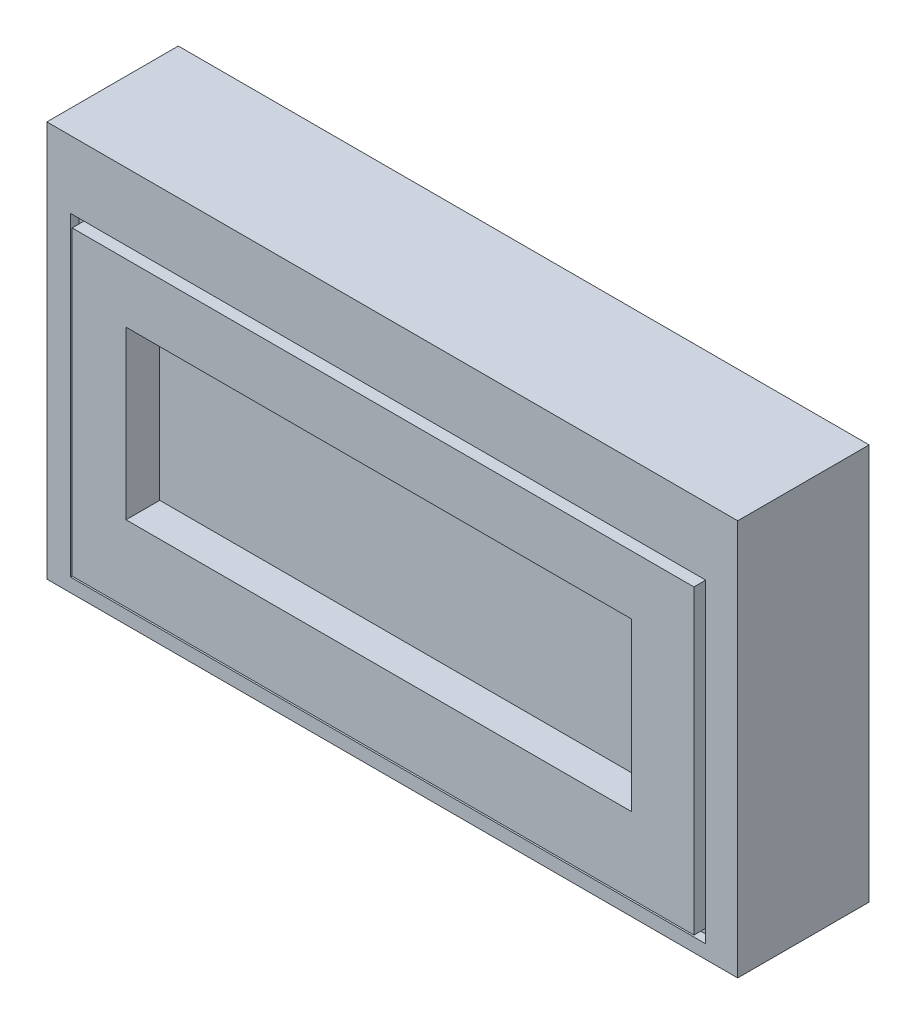
ISO-10303-21;
HEADER;
FILE_DESCRIPTION(('STEP AP214'),'2;1');
FILE_NAME('part.step','',(''),(''),'','','');
FILE_SCHEMA(('AUTOMOTIVE_DESIGN { 1 0 10303 214 1 1 1 1 }'));
ENDSEC;
DATA;
#1=APPLICATION_CONTEXT('core data for automotive mechanical design processes');
#2=APPLICATION_PROTOCOL_DEFINITION('international standard','automotive_design',2000,#1);
#3=PRODUCT_CONTEXT('',#1,'mechanical');
#4=PRODUCT('Part','Part','',(#3));
#5=PRODUCT_RELATED_PRODUCT_CATEGORY('part','',(#4));
#6=PRODUCT_DEFINITION_FORMATION('','',#4);
#7=PRODUCT_DEFINITION_CONTEXT('part definition',#1,'design');
#8=PRODUCT_DEFINITION('design','',#6,#7);
#9=PRODUCT_DEFINITION_SHAPE('','',#8);
#10=(LENGTH_UNIT() NAMED_UNIT(*) SI_UNIT(.MILLI.,.METRE.));
#11=(NAMED_UNIT(*) PLANE_ANGLE_UNIT() SI_UNIT($,.RADIAN.));
#12=(NAMED_UNIT(*) SI_UNIT($,.STERADIAN.) SOLID_ANGLE_UNIT());
#13=UNCERTAINTY_MEASURE_WITH_UNIT(LENGTH_MEASURE(1.E-05),#10,'distance_accuracy_value','');
#14=(GEOMETRIC_REPRESENTATION_CONTEXT(3) GLOBAL_UNCERTAINTY_ASSIGNED_CONTEXT((#13)) GLOBAL_UNIT_ASSIGNED_CONTEXT((#10,
#11,#12)) REPRESENTATION_CONTEXT('',''));
#15=CARTESIAN_POINT('',(0.,0.,0.));
#16=DIRECTION('',(0.,0.,1.));
#17=DIRECTION('',(1.,0.,0.));
#18=AXIS2_PLACEMENT_3D('',#15,#16,#17);
#19=CARTESIAN_POINT('',(0.,0.,73.));
#20=DIRECTION('',(0.,0.,1.));
#21=DIRECTION('',(1.,0.,0.));
#22=AXIS2_PLACEMENT_3D('',#19,#20,#21);
#23=PLANE('',#22);
#24=DIRECTION('',(0.,1.,0.));
#25=VECTOR('',#24,1.);
#26=CARTESIAN_POINT('',(347.576639223275,0.,73.));
#27=LINE('',#26,#25);
#28=CARTESIAN_POINT('',(347.576639223275,0.,73.));
#29=VERTEX_POINT('',#28);
#30=CARTESIAN_POINT('',(347.576639223275,186.930394922426,73.));
#31=VERTEX_POINT('',#30);
#32=EDGE_CURVE('E213',#29,#31,#27,.T.);
#33=ORIENTED_EDGE('',*,*,#32,.T.);
#34=DIRECTION('',(-1.,0.,0.));
#35=VECTOR('',#34,1.);
#36=CARTESIAN_POINT('',(347.576639223275,186.930394922426,73.));
#37=LINE('',#36,#35);
#38=CARTESIAN_POINT('',(-29.4233607767245,186.930394922426,73.));
#39=VERTEX_POINT('',#38);
#40=EDGE_CURVE('E216',#31,#39,#37,.T.);
#41=ORIENTED_EDGE('',*,*,#40,.T.);
#42=DIRECTION('',(0.,-1.,0.));
#43=VECTOR('',#42,1.);
#44=CARTESIAN_POINT('',(-29.4233607767245,186.930394922426,73.));
#45=LINE('',#44,#43);
#46=CARTESIAN_POINT('',(-29.4233607767245,0.,73.));
#47=VERTEX_POINT('',#46);
#48=EDGE_CURVE('E220',#39,#47,#45,.T.);
#49=ORIENTED_EDGE('',*,*,#48,.T.);
#50=DIRECTION('',(1.,0.,0.));
#51=VECTOR('',#50,1.);
#52=CARTESIAN_POINT('',(-29.4233607767245,0.,73.));
#53=LINE('',#52,#51);
#54=EDGE_CURVE('E223',#47,#29,#53,.T.);
#55=ORIENTED_EDGE('',*,*,#54,.T.);
#56=EDGE_LOOP('',(#33,#41,#49,#55));
#57=FACE_BOUND('',#56,.T.);
#58=DIRECTION('',(1.,0.,0.));
#59=VECTOR('',#58,1.);
#60=CARTESIAN_POINT('',(-25.4233607767246,4.,73.));
#61=LINE('',#60,#59);
#62=CARTESIAN_POINT('',(-25.4233607767246,4.,73.));
#63=VERTEX_POINT('',#62);
#64=CARTESIAN_POINT('',(343.576639223276,4.,73.));
#65=VERTEX_POINT('',#64);
#66=EDGE_CURVE('E199',#63,#65,#61,.T.);
#67=ORIENTED_EDGE('',*,*,#66,.F.);
#68=DIRECTION('',(0.,-1.,0.));
#69=VECTOR('',#68,1.);
#70=CARTESIAN_POINT('',(-25.4233607767246,182.930394922426,73.));
#71=LINE('',#70,#69);
#72=CARTESIAN_POINT('',(-25.4233607767246,182.930394922426,73.));
#73=VERTEX_POINT('',#72);
#74=EDGE_CURVE('E182',#73,#63,#71,.T.);
#75=ORIENTED_EDGE('',*,*,#74,.F.);
#76=DIRECTION('',(-1.,0.,0.));
#77=VECTOR('',#76,1.);
#78=CARTESIAN_POINT('',(-25.4233607767246,182.930394922426,73.));
#79=LINE('',#78,#77);
#80=CARTESIAN_POINT('',(343.576639223276,182.930394922426,73.));
#81=VERTEX_POINT('',#80);
#82=EDGE_CURVE('E190',#81,#73,#79,.T.);
#83=ORIENTED_EDGE('',*,*,#82,.F.);
#84=DIRECTION('',(0.,1.,0.));
#85=VECTOR('',#84,1.);
#86=CARTESIAN_POINT('',(343.576639223276,182.930394922426,73.));
#87=LINE('',#86,#85);
#88=EDGE_CURVE('E201',#65,#81,#87,.T.);
#89=ORIENTED_EDGE('',*,*,#88,.F.);
#90=EDGE_LOOP('',(#67,#75,#83,#89));
#91=FACE_BOUND('',#90,.T.);
#92=ADVANCED_FACE('F33',(#57,#91),#23,.T.);
#93=CARTESIAN_POINT('',(-43.4233607767245,226.930394922426,78.));
#94=DIRECTION('',(1.,0.,0.));
#95=DIRECTION('',(0.,1.,0.));
#96=AXIS2_PLACEMENT_3D('',#93,#94,#95);
#97=PLANE('',#96);
#98=DIRECTION('',(0.,-1.,0.));
#99=VECTOR('',#98,1.);
#100=CARTESIAN_POINT('',(-43.4233607767245,226.930394922426,0.));
#101=LINE('',#100,#99);
#102=CARTESIAN_POINT('',(-43.4233607767245,226.930394922426,0.));
#103=VERTEX_POINT('',#102);
#104=CARTESIAN_POINT('',(-43.4233607767245,-8.06960507757404,0.));
#105=VERTEX_POINT('',#104);
#106=EDGE_CURVE('E238',#103,#105,#101,.T.);
#107=ORIENTED_EDGE('',*,*,#106,.T.);
#108=DIRECTION('',(0.,0.,-1.));
#109=VECTOR('',#108,1.);
#110=CARTESIAN_POINT('',(-43.4233607767245,-8.06960507757404,78.));
#111=LINE('',#110,#109);
#112=CARTESIAN_POINT('',(-43.4233607767245,-8.06960507757404,78.));
#113=VERTEX_POINT('',#112);
#114=EDGE_CURVE('E11',#113,#105,#111,.T.);
#115=ORIENTED_EDGE('',*,*,#114,.F.);
#116=DIRECTION('',(0.,-1.,0.));
#117=VECTOR('',#116,1.);
#118=CARTESIAN_POINT('',(-43.4233607767245,226.930394922426,78.));
#119=LINE('',#118,#117);
#120=CARTESIAN_POINT('',(-43.4233607767245,226.930394922426,78.));
#121=VERTEX_POINT('',#120);
#122=EDGE_CURVE('E245',#121,#113,#119,.T.);
#123=ORIENTED_EDGE('',*,*,#122,.F.);
#124=DIRECTION('',(0.,0.,-1.));
#125=VECTOR('',#124,1.);
#126=CARTESIAN_POINT('',(-43.4233607767245,226.930394922426,78.));
#127=LINE('',#126,#125);
#128=EDGE_CURVE('E255',#121,#103,#127,.T.);
#129=ORIENTED_EDGE('',*,*,#128,.T.);
#130=EDGE_LOOP('',(#107,#115,#123,#129));
#131=FACE_BOUND('',#130,.T.);
#132=ADVANCED_FACE('F35',(#131),#97,.F.);
#133=CARTESIAN_POINT('',(-43.4233607767245,-8.06960507757404,78.));
#134=DIRECTION('',(0.,1.,0.));
#135=DIRECTION('',(0.,0.,1.));
#136=AXIS2_PLACEMENT_3D('',#133,#134,#135);
#137=PLANE('',#136);
#138=DIRECTION('',(1.,0.,0.));
#139=VECTOR('',#138,1.);
#140=CARTESIAN_POINT('',(-43.4233607767245,-8.06960507757404,0.));
#141=LINE('',#140,#139);
#142=CARTESIAN_POINT('',(366.576639223275,-8.06960507757404,0.));
#143=VERTEX_POINT('',#142);
#144=EDGE_CURVE('E258',#105,#143,#141,.T.);
#145=ORIENTED_EDGE('',*,*,#144,.T.);
#146=DIRECTION('',(0.,0.,-1.));
#147=VECTOR('',#146,1.);
#148=CARTESIAN_POINT('',(366.576639223275,-8.06960507757404,78.));
#149=LINE('',#148,#147);
#150=CARTESIAN_POINT('',(366.576639223275,-8.06960507757404,78.));
#151=VERTEX_POINT('',#150);
#152=EDGE_CURVE('E41',#151,#143,#149,.T.);
#153=ORIENTED_EDGE('',*,*,#152,.F.);
#154=DIRECTION('',(1.,0.,0.));
#155=VECTOR('',#154,1.);
#156=CARTESIAN_POINT('',(-43.4233607767245,-8.06960507757404,78.));
#157=LINE('',#156,#155);
#158=EDGE_CURVE('E248',#113,#151,#157,.T.);
#159=ORIENTED_EDGE('',*,*,#158,.F.);
#160=ORIENTED_EDGE('',*,*,#114,.T.);
#161=EDGE_LOOP('',(#145,#153,#159,#160));
#162=FACE_BOUND('',#161,.T.);
#163=ADVANCED_FACE('F288',(#162),#137,.F.);
#164=CARTESIAN_POINT('',(366.576639223276,226.930394922426,78.));
#165=DIRECTION('',(-1.,0.,0.));
#166=DIRECTION('',(0.,-1.,0.));
#167=AXIS2_PLACEMENT_3D('',#164,#165,#166);
#168=PLANE('',#167);
#169=DIRECTION('',(0.,1.,0.));
#170=VECTOR('',#169,1.);
#171=CARTESIAN_POINT('',(366.576639223276,226.930394922426,0.));
#172=LINE('',#171,#170);
#173=CARTESIAN_POINT('',(366.576639223276,226.930394922426,0.));
#174=VERTEX_POINT('',#173);
#175=EDGE_CURVE('E260',#143,#174,#172,.T.);
#176=ORIENTED_EDGE('',*,*,#175,.T.);
#177=DIRECTION('',(0.,0.,-1.));
#178=VECTOR('',#177,1.);
#179=CARTESIAN_POINT('',(366.576639223276,226.930394922426,78.));
#180=LINE('',#179,#178);
#181=CARTESIAN_POINT('',(366.576639223276,226.930394922426,78.));
#182=VERTEX_POINT('',#181);
#183=EDGE_CURVE('E265',#182,#174,#180,.T.);
#184=ORIENTED_EDGE('',*,*,#183,.F.);
#185=DIRECTION('',(0.,1.,0.));
#186=VECTOR('',#185,1.);
#187=CARTESIAN_POINT('',(366.576639223276,226.930394922426,78.));
#188=LINE('',#187,#186);
#189=EDGE_CURVE('E251',#151,#182,#188,.T.);
#190=ORIENTED_EDGE('',*,*,#189,.F.);
#191=ORIENTED_EDGE('',*,*,#152,.T.);
#192=EDGE_LOOP('',(#176,#184,#190,#191));
#193=FACE_BOUND('',#192,.T.);
#194=ADVANCED_FACE('F272',(#193),#168,.F.);
#195=CARTESIAN_POINT('',(-43.4233607767245,226.930394922426,78.));
#196=DIRECTION('',(0.,-1.,0.));
#197=DIRECTION('',(0.,0.,-1.));
#198=AXIS2_PLACEMENT_3D('',#195,#196,#197);
#199=PLANE('',#198);
#200=DIRECTION('',(-1.,0.,0.));
#201=VECTOR('',#200,1.);
#202=CARTESIAN_POINT('',(-43.4233607767245,226.930394922426,0.));
#203=LINE('',#202,#201);
#204=EDGE_CURVE('E249',#174,#103,#203,.T.);
#205=ORIENTED_EDGE('',*,*,#204,.T.);
#206=ORIENTED_EDGE('',*,*,#128,.F.);
#207=DIRECTION('',(-1.,0.,0.));
#208=VECTOR('',#207,1.);
#209=CARTESIAN_POINT('',(-43.4233607767245,226.930394922426,78.));
#210=LINE('',#209,#208);
#211=EDGE_CURVE('E253',#182,#121,#210,.T.);
#212=ORIENTED_EDGE('',*,*,#211,.F.);
#213=ORIENTED_EDGE('',*,*,#183,.T.);
#214=EDGE_LOOP('',(#205,#206,#212,#213));
#215=FACE_BOUND('',#214,.T.);
#216=ADVANCED_FACE('F281',(#215),#199,.F.);
#217=CARTESIAN_POINT('',(0.,0.,78.));
#218=DIRECTION('',(0.,0.,1.));
#219=DIRECTION('',(1.,0.,0.));
#220=AXIS2_PLACEMENT_3D('',#217,#218,#219);
#221=PLANE('',#220);
#222=DIRECTION('',(0.,1.,0.));
#223=VECTOR('',#222,1.);
#224=CARTESIAN_POINT('',(347.576639223275,0.,78.));
#225=LINE('',#224,#223);
#226=CARTESIAN_POINT('',(347.576639223275,0.,78.));
#227=VERTEX_POINT('',#226);
#228=CARTESIAN_POINT('',(347.576639223275,186.930394922426,78.));
#229=VERTEX_POINT('',#228);
#230=EDGE_CURVE('E212',#227,#229,#225,.T.);
#231=ORIENTED_EDGE('',*,*,#230,.F.);
#232=DIRECTION('',(1.,0.,0.));
#233=VECTOR('',#232,1.);
#234=CARTESIAN_POINT('',(-29.4233607767245,0.,78.));
#235=LINE('',#234,#233);
#236=CARTESIAN_POINT('',(-29.4233607767245,0.,78.));
#237=VERTEX_POINT('',#236);
#238=EDGE_CURVE('E217',#237,#227,#235,.T.);
#239=ORIENTED_EDGE('',*,*,#238,.F.);
#240=DIRECTION('',(0.,-1.,0.));
#241=VECTOR('',#240,1.);
#242=CARTESIAN_POINT('',(-29.4233607767245,186.930394922426,78.));
#243=LINE('',#242,#241);
#244=CARTESIAN_POINT('',(-29.4233607767245,186.930394922426,78.));
#245=VERTEX_POINT('',#244);
#246=EDGE_CURVE('E231',#245,#237,#243,.T.);
#247=ORIENTED_EDGE('',*,*,#246,.F.);
#248=DIRECTION('',(-1.,0.,0.));
#249=VECTOR('',#248,1.);
#250=CARTESIAN_POINT('',(347.576639223275,186.930394922426,78.));
#251=LINE('',#250,#249);
#252=EDGE_CURVE('E228',#229,#245,#251,.T.);
#253=ORIENTED_EDGE('',*,*,#252,.F.);
#254=EDGE_LOOP('',(#231,#239,#247,#253));
#255=FACE_BOUND('',#254,.T.);
#256=ORIENTED_EDGE('',*,*,#122,.T.);
#257=ORIENTED_EDGE('',*,*,#158,.T.);
#258=ORIENTED_EDGE('',*,*,#189,.T.);
#259=ORIENTED_EDGE('',*,*,#211,.T.);
#260=EDGE_LOOP('',(#256,#257,#258,#259));
#261=FACE_BOUND('',#260,.T.);
#262=ADVANCED_FACE('F287',(#255,#261),#221,.T.);
#263=CARTESIAN_POINT('',(0.,0.,0.));
#264=DIRECTION('',(0.,0.,1.));
#265=DIRECTION('',(1.,0.,0.));
#266=AXIS2_PLACEMENT_3D('',#263,#264,#265);
#267=PLANE('',#266);
#268=ORIENTED_EDGE('',*,*,#106,.F.);
#269=ORIENTED_EDGE('',*,*,#204,.F.);
#270=ORIENTED_EDGE('',*,*,#175,.F.);
#271=ORIENTED_EDGE('',*,*,#144,.F.);
#272=EDGE_LOOP('',(#268,#269,#270,#271));
#273=FACE_BOUND('',#272,.T.);
#274=ADVANCED_FACE('F278',(#273),#267,.F.);
#275=CARTESIAN_POINT('',(347.576639223275,0.,73.));
#276=DIRECTION('',(1.,0.,0.));
#277=DIRECTION('',(0.,0.,-1.));
#278=AXIS2_PLACEMENT_3D('',#275,#276,#277);
#279=PLANE('',#278);
#280=ORIENTED_EDGE('',*,*,#230,.T.);
#281=DIRECTION('',(0.,0.,1.));
#282=VECTOR('',#281,1.);
#283=CARTESIAN_POINT('',(347.576639223275,186.930394922426,73.));
#284=LINE('',#283,#282);
#285=EDGE_CURVE('E226',#31,#229,#284,.T.);
#286=ORIENTED_EDGE('',*,*,#285,.F.);
#287=ORIENTED_EDGE('',*,*,#32,.F.);
#288=DIRECTION('',(0.,0.,1.));
#289=VECTOR('',#288,1.);
#290=CARTESIAN_POINT('',(347.576639223275,0.,73.));
#291=LINE('',#290,#289);
#292=EDGE_CURVE('E236',#29,#227,#291,.T.);
#293=ORIENTED_EDGE('',*,*,#292,.T.);
#294=EDGE_LOOP('',(#280,#286,#287,#293));
#295=FACE_BOUND('',#294,.T.);
#296=ADVANCED_FACE('F309',(#295),#279,.F.);
#297=CARTESIAN_POINT('',(-29.4233607767245,0.,73.));
#298=DIRECTION('',(0.,-1.,0.));
#299=DIRECTION('',(0.,0.,-1.));
#300=AXIS2_PLACEMENT_3D('',#297,#298,#299);
#301=PLANE('',#300);
#302=ORIENTED_EDGE('',*,*,#238,.T.);
#303=ORIENTED_EDGE('',*,*,#292,.F.);
#304=ORIENTED_EDGE('',*,*,#54,.F.);
#305=DIRECTION('',(0.,0.,1.));
#306=VECTOR('',#305,1.);
#307=CARTESIAN_POINT('',(-29.4233607767245,0.,73.));
#308=LINE('',#307,#306);
#309=EDGE_CURVE('E239',#47,#237,#308,.T.);
#310=ORIENTED_EDGE('',*,*,#309,.T.);
#311=EDGE_LOOP('',(#302,#303,#304,#310));
#312=FACE_BOUND('',#311,.T.);
#313=ADVANCED_FACE('F305',(#312),#301,.F.);
#314=CARTESIAN_POINT('',(-29.4233607767245,186.930394922426,73.));
#315=DIRECTION('',(-1.,0.,0.));
#316=DIRECTION('',(0.,0.,1.));
#317=AXIS2_PLACEMENT_3D('',#314,#315,#316);
#318=PLANE('',#317);
#319=ORIENTED_EDGE('',*,*,#246,.T.);
#320=ORIENTED_EDGE('',*,*,#309,.F.);
#321=ORIENTED_EDGE('',*,*,#48,.F.);
#322=DIRECTION('',(0.,0.,1.));
#323=VECTOR('',#322,1.);
#324=CARTESIAN_POINT('',(-29.4233607767245,186.930394922426,73.));
#325=LINE('',#324,#323);
#326=EDGE_CURVE('E241',#39,#245,#325,.T.);
#327=ORIENTED_EDGE('',*,*,#326,.T.);
#328=EDGE_LOOP('',(#319,#320,#321,#327));
#329=FACE_BOUND('',#328,.T.);
#330=ADVANCED_FACE('F308',(#329),#318,.F.);
#331=CARTESIAN_POINT('',(347.576639223275,186.930394922426,73.));
#332=DIRECTION('',(0.,1.,0.));
#333=DIRECTION('',(0.,0.,1.));
#334=AXIS2_PLACEMENT_3D('',#331,#332,#333);
#335=PLANE('',#334);
#336=ORIENTED_EDGE('',*,*,#252,.T.);
#337=ORIENTED_EDGE('',*,*,#326,.F.);
#338=ORIENTED_EDGE('',*,*,#40,.F.);
#339=ORIENTED_EDGE('',*,*,#285,.T.);
#340=EDGE_LOOP('',(#336,#337,#338,#339));
#341=FACE_BOUND('',#340,.T.);
#342=ADVANCED_FACE('F313',(#341),#335,.F.);
#343=CARTESIAN_POINT('',(-25.4233607767246,182.930394922426,81.));
#344=DIRECTION('',(1.,0.,0.));
#345=DIRECTION('',(0.,1.,0.));
#346=AXIS2_PLACEMENT_3D('',#343,#344,#345);
#347=PLANE('',#346);
#348=ORIENTED_EDGE('',*,*,#74,.T.);
#349=DIRECTION('',(0.,0.,-1.));
#350=VECTOR('',#349,1.);
#351=CARTESIAN_POINT('',(-25.4233607767246,4.,81.));
#352=LINE('',#351,#350);
#353=CARTESIAN_POINT('',(-25.4233607767246,4.,81.));
#354=VERTEX_POINT('',#353);
#355=EDGE_CURVE('E210',#354,#63,#352,.T.);
#356=ORIENTED_EDGE('',*,*,#355,.F.);
#357=DIRECTION('',(0.,-1.,0.));
#358=VECTOR('',#357,1.);
#359=CARTESIAN_POINT('',(-25.4233607767246,182.930394922426,81.));
#360=LINE('',#359,#358);
#361=CARTESIAN_POINT('',(-25.4233607767246,182.930394922426,81.));
#362=VERTEX_POINT('',#361);
#363=EDGE_CURVE('E186',#362,#354,#360,.T.);
#364=ORIENTED_EDGE('',*,*,#363,.F.);
#365=DIRECTION('',(0.,0.,-1.));
#366=VECTOR('',#365,1.);
#367=CARTESIAN_POINT('',(-25.4233607767246,182.930394922426,81.));
#368=LINE('',#367,#366);
#369=EDGE_CURVE('E196',#362,#73,#368,.T.);
#370=ORIENTED_EDGE('',*,*,#369,.T.);
#371=EDGE_LOOP('',(#348,#356,#364,#370));
#372=FACE_BOUND('',#371,.T.);
#373=ADVANCED_FACE('F303',(#372),#347,.F.);
#374=CARTESIAN_POINT('',(-25.4233607767246,4.,81.));
#375=DIRECTION('',(0.,1.,0.));
#376=DIRECTION('',(0.,0.,1.));
#377=AXIS2_PLACEMENT_3D('',#374,#375,#376);
#378=PLANE('',#377);
#379=ORIENTED_EDGE('',*,*,#66,.T.);
#380=DIRECTION('',(0.,0.,-1.));
#381=VECTOR('',#380,1.);
#382=CARTESIAN_POINT('',(343.576639223276,4.,81.));
#383=LINE('',#382,#381);
#384=CARTESIAN_POINT('',(343.576639223276,4.,81.));
#385=VERTEX_POINT('',#384);
#386=EDGE_CURVE('E207',#385,#65,#383,.T.);
#387=ORIENTED_EDGE('',*,*,#386,.F.);
#388=DIRECTION('',(1.,0.,0.));
#389=VECTOR('',#388,1.);
#390=CARTESIAN_POINT('',(-25.4233607767246,4.,81.));
#391=LINE('',#390,#389);
#392=EDGE_CURVE('E189',#354,#385,#391,.T.);
#393=ORIENTED_EDGE('',*,*,#392,.F.);
#394=ORIENTED_EDGE('',*,*,#355,.T.);
#395=EDGE_LOOP('',(#379,#387,#393,#394));
#396=FACE_BOUND('',#395,.T.);
#397=ADVANCED_FACE('F361',(#396),#378,.F.);
#398=CARTESIAN_POINT('',(343.576639223276,182.930394922426,81.));
#399=DIRECTION('',(-1.,0.,0.));
#400=DIRECTION('',(0.,0.,1.));
#401=AXIS2_PLACEMENT_3D('',#398,#399,#400);
#402=PLANE('',#401);
#403=ORIENTED_EDGE('',*,*,#88,.T.);
#404=DIRECTION('',(0.,0.,-1.));
#405=VECTOR('',#404,1.);
#406=CARTESIAN_POINT('',(343.576639223276,182.930394922426,81.));
#407=LINE('',#406,#405);
#408=CARTESIAN_POINT('',(343.576639223276,182.930394922426,81.));
#409=VERTEX_POINT('',#408);
#410=EDGE_CURVE('E56',#409,#81,#407,.T.);
#411=ORIENTED_EDGE('',*,*,#410,.F.);
#412=DIRECTION('',(0.,1.,0.));
#413=VECTOR('',#412,1.);
#414=CARTESIAN_POINT('',(343.576639223276,182.930394922426,81.));
#415=LINE('',#414,#413);
#416=EDGE_CURVE('E192',#385,#409,#415,.T.);
#417=ORIENTED_EDGE('',*,*,#416,.F.);
#418=ORIENTED_EDGE('',*,*,#386,.T.);
#419=EDGE_LOOP('',(#403,#411,#417,#418));
#420=FACE_BOUND('',#419,.T.);
#421=ADVANCED_FACE('F368',(#420),#402,.F.);
#422=CARTESIAN_POINT('',(-25.4233607767246,182.930394922426,81.));
#423=DIRECTION('',(0.,-1.,0.));
#424=DIRECTION('',(0.,0.,-1.));
#425=AXIS2_PLACEMENT_3D('',#422,#423,#424);
#426=PLANE('',#425);
#427=ORIENTED_EDGE('',*,*,#82,.T.);
#428=ORIENTED_EDGE('',*,*,#369,.F.);
#429=DIRECTION('',(-1.,0.,0.));
#430=VECTOR('',#429,1.);
#431=CARTESIAN_POINT('',(-25.4233607767246,182.930394922426,81.));
#432=LINE('',#431,#430);
#433=EDGE_CURVE('E194',#409,#362,#432,.T.);
#434=ORIENTED_EDGE('',*,*,#433,.F.);
#435=ORIENTED_EDGE('',*,*,#410,.T.);
#436=EDGE_LOOP('',(#427,#428,#434,#435));
#437=FACE_BOUND('',#436,.T.);
#438=ADVANCED_FACE('F375',(#437),#426,.F.);
#439=CARTESIAN_POINT('',(0.,0.,81.));
#440=DIRECTION('',(0.,0.,1.));
#441=DIRECTION('',(1.,0.,0.));
#442=AXIS2_PLACEMENT_3D('',#439,#440,#441);
#443=PLANE('',#442);
#444=DIRECTION('',(0.,-1.,0.));
#445=VECTOR('',#444,1.);
#446=CARTESIAN_POINT('',(6.57663922327552,48.930394922426,81.));
#447=LINE('',#446,#445);
#448=CARTESIAN_POINT('',(6.57663922327552,147.930394922426,81.));
#449=VERTEX_POINT('',#448);
#450=CARTESIAN_POINT('',(6.57663922327552,48.930394922426,81.));
#451=VERTEX_POINT('',#450);
#452=EDGE_CURVE('E48',#449,#451,#447,.T.);
#453=ORIENTED_EDGE('',*,*,#452,.F.);
#454=DIRECTION('',(-1.,0.,0.));
#455=VECTOR('',#454,1.);
#456=CARTESIAN_POINT('',(6.57663922327552,147.930394922426,81.));
#457=LINE('',#456,#455);
#458=CARTESIAN_POINT('',(306.576639223275,147.930394922426,81.));
#459=VERTEX_POINT('',#458);
#460=EDGE_CURVE('E167',#459,#449,#457,.T.);
#461=ORIENTED_EDGE('',*,*,#460,.F.);
#462=DIRECTION('',(0.,1.,0.));
#463=VECTOR('',#462,1.);
#464=CARTESIAN_POINT('',(306.576639223275,48.930394922426,81.));
#465=LINE('',#464,#463);
#466=CARTESIAN_POINT('',(306.576639223275,48.930394922426,81.));
#467=VERTEX_POINT('',#466);
#468=EDGE_CURVE('E170',#467,#459,#465,.T.);
#469=ORIENTED_EDGE('',*,*,#468,.F.);
#470=DIRECTION('',(1.,0.,0.));
#471=VECTOR('',#470,1.);
#472=CARTESIAN_POINT('',(6.57663922327552,48.930394922426,81.));
#473=LINE('',#472,#471);
#474=EDGE_CURVE('E176',#451,#467,#473,.T.);
#475=ORIENTED_EDGE('',*,*,#474,.F.);
#476=EDGE_LOOP('',(#453,#461,#469,#475));
#477=FACE_BOUND('',#476,.T.);
#478=ORIENTED_EDGE('',*,*,#363,.T.);
#479=ORIENTED_EDGE('',*,*,#392,.T.);
#480=ORIENTED_EDGE('',*,*,#416,.T.);
#481=ORIENTED_EDGE('',*,*,#433,.T.);
#482=EDGE_LOOP('',(#478,#479,#480,#481));
#483=FACE_BOUND('',#482,.T.);
#484=ADVANCED_FACE('F383',(#477,#483),#443,.T.);
#485=CARTESIAN_POINT('',(6.57663922327552,48.930394922426,61.));
#486=DIRECTION('',(-1.,0.,0.));
#487=DIRECTION('',(0.,0.,1.));
#488=AXIS2_PLACEMENT_3D('',#485,#486,#487);
#489=PLANE('',#488);
#490=ORIENTED_EDGE('',*,*,#452,.T.);
#491=DIRECTION('',(0.,0.,1.));
#492=VECTOR('',#491,1.);
#493=CARTESIAN_POINT('',(6.57663922327552,48.930394922426,61.));
#494=LINE('',#493,#492);
#495=CARTESIAN_POINT('',(6.57663922327552,48.930394922426,61.));
#496=VERTEX_POINT('',#495);
#497=EDGE_CURVE('E145',#496,#451,#494,.T.);
#498=ORIENTED_EDGE('',*,*,#497,.F.);
#499=DIRECTION('',(0.,-1.,0.));
#500=VECTOR('',#499,1.);
#501=CARTESIAN_POINT('',(6.57663922327552,48.930394922426,61.));
#502=LINE('',#501,#500);
#503=CARTESIAN_POINT('',(6.57663922327552,147.930394922426,61.));
#504=VERTEX_POINT('',#503);
#505=EDGE_CURVE('E149',#504,#496,#502,.T.);
#506=ORIENTED_EDGE('',*,*,#505,.F.);
#507=DIRECTION('',(0.,0.,1.));
#508=VECTOR('',#507,1.);
#509=CARTESIAN_POINT('',(6.57663922327552,147.930394922426,61.));
#510=LINE('',#509,#508);
#511=EDGE_CURVE('E180',#504,#449,#510,.T.);
#512=ORIENTED_EDGE('',*,*,#511,.T.);
#513=EDGE_LOOP('',(#490,#498,#506,#512));
#514=FACE_BOUND('',#513,.T.);
#515=ADVANCED_FACE('F147',(#514),#489,.F.);
#516=CARTESIAN_POINT('',(6.57663922327552,147.930394922426,61.));
#517=DIRECTION('',(0.,1.,0.));
#518=DIRECTION('',(0.,0.,1.));
#519=AXIS2_PLACEMENT_3D('',#516,#517,#518);
#520=PLANE('',#519);
#521=ORIENTED_EDGE('',*,*,#460,.T.);
#522=ORIENTED_EDGE('',*,*,#511,.F.);
#523=DIRECTION('',(-1.,0.,0.));
#524=VECTOR('',#523,1.);
#525=CARTESIAN_POINT('',(6.57663922327552,147.930394922426,61.));
#526=LINE('',#525,#524);
#527=CARTESIAN_POINT('',(306.576639223275,147.930394922426,61.));
#528=VERTEX_POINT('',#527);
#529=EDGE_CURVE('E155',#528,#504,#526,.T.);
#530=ORIENTED_EDGE('',*,*,#529,.F.);
#531=DIRECTION('',(0.,0.,1.));
#532=VECTOR('',#531,1.);
#533=CARTESIAN_POINT('',(306.576639223275,147.930394922426,61.));
#534=LINE('',#533,#532);
#535=EDGE_CURVE('E183',#528,#459,#534,.T.);
#536=ORIENTED_EDGE('',*,*,#535,.T.);
#537=EDGE_LOOP('',(#521,#522,#530,#536));
#538=FACE_BOUND('',#537,.T.);
#539=ADVANCED_FACE('F397',(#538),#520,.F.);
#540=CARTESIAN_POINT('',(306.576639223275,48.930394922426,61.));
#541=DIRECTION('',(1.,0.,0.));
#542=DIRECTION('',(0.,0.,-1.));
#543=AXIS2_PLACEMENT_3D('',#540,#541,#542);
#544=PLANE('',#543);
#545=ORIENTED_EDGE('',*,*,#468,.T.);
#546=ORIENTED_EDGE('',*,*,#535,.F.);
#547=DIRECTION('',(0.,1.,0.));
#548=VECTOR('',#547,1.);
#549=CARTESIAN_POINT('',(306.576639223275,48.930394922426,61.));
#550=LINE('',#549,#548);
#551=CARTESIAN_POINT('',(306.576639223275,48.930394922426,61.));
#552=VERTEX_POINT('',#551);
#553=EDGE_CURVE('E163',#552,#528,#550,.T.);
#554=ORIENTED_EDGE('',*,*,#553,.F.);
#555=DIRECTION('',(0.,0.,1.));
#556=VECTOR('',#555,1.);
#557=CARTESIAN_POINT('',(306.576639223275,48.930394922426,61.));
#558=LINE('',#557,#556);
#559=EDGE_CURVE('E154',#552,#467,#558,.T.);
#560=ORIENTED_EDGE('',*,*,#559,.T.);
#561=EDGE_LOOP('',(#545,#546,#554,#560));
#562=FACE_BOUND('',#561,.T.);
#563=ADVANCED_FACE('F404',(#562),#544,.F.);
#564=CARTESIAN_POINT('',(6.57663922327552,48.930394922426,61.));
#565=DIRECTION('',(0.,-1.,0.));
#566=DIRECTION('',(0.,0.,-1.));
#567=AXIS2_PLACEMENT_3D('',#564,#565,#566);
#568=PLANE('',#567);
#569=ORIENTED_EDGE('',*,*,#474,.T.);
#570=ORIENTED_EDGE('',*,*,#559,.F.);
#571=DIRECTION('',(1.,0.,0.));
#572=VECTOR('',#571,1.);
#573=CARTESIAN_POINT('',(6.57663922327552,48.930394922426,61.));
#574=LINE('',#573,#572);
#575=EDGE_CURVE('E158',#496,#552,#574,.T.);
#576=ORIENTED_EDGE('',*,*,#575,.F.);
#577=ORIENTED_EDGE('',*,*,#497,.T.);
#578=EDGE_LOOP('',(#569,#570,#576,#577));
#579=FACE_BOUND('',#578,.T.);
#580=ADVANCED_FACE('F159',(#579),#568,.F.);
#581=CARTESIAN_POINT('',(0.,0.,61.));
#582=DIRECTION('',(0.,0.,-1.));
#583=DIRECTION('',(-1.,0.,0.));
#584=AXIS2_PLACEMENT_3D('',#581,#582,#583);
#585=PLANE('',#584);
#586=ORIENTED_EDGE('',*,*,#505,.T.);
#587=ORIENTED_EDGE('',*,*,#575,.T.);
#588=ORIENTED_EDGE('',*,*,#553,.T.);
#589=ORIENTED_EDGE('',*,*,#529,.T.);
#590=EDGE_LOOP('',(#586,#587,#588,#589));
#591=FACE_BOUND('',#590,.T.);
#592=ADVANCED_FACE('F165',(#591),#585,.F.);
#593=CLOSED_SHELL('',(#92,#132,#163,#194,#216,#262,#274,#296,#313,#330,#342,#373,#397,#421,#438,
#484,#515,#539,#563,#580,#592));
#594=MANIFOLD_SOLID_BREP('B2',#593);
#595=ADVANCED_BREP_SHAPE_REPRESENTATION('',(#18,#594),#14);
#596=SHAPE_DEFINITION_REPRESENTATION(#9,#595);
ENDSEC;
END-ISO-10303-21;
